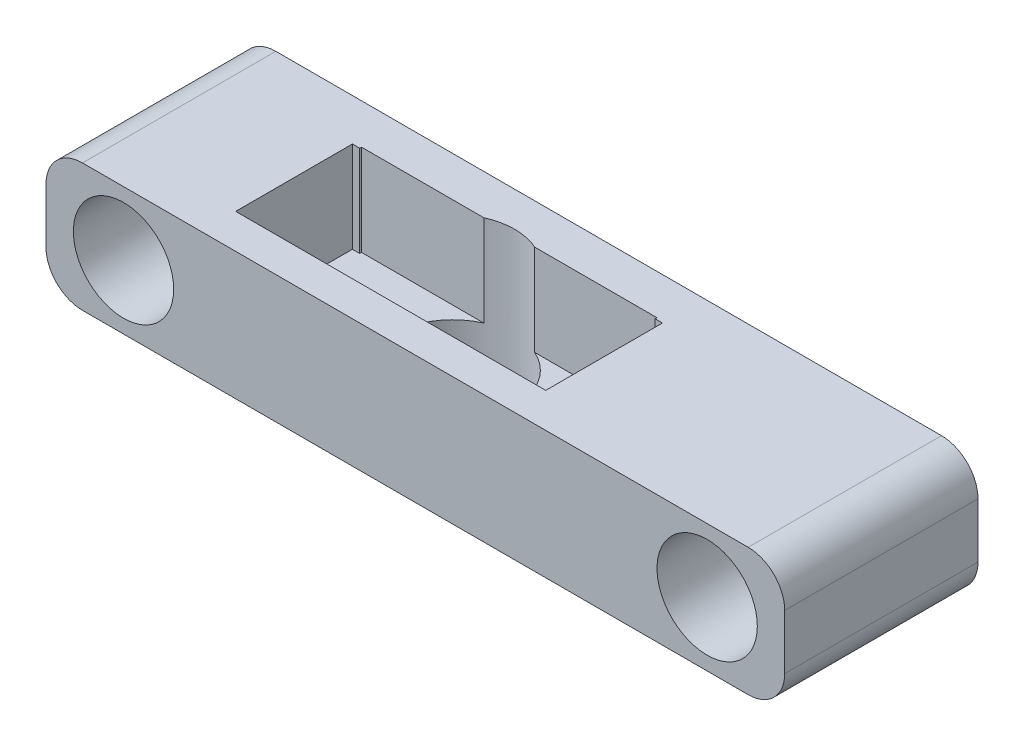
ISO-10303-21;
HEADER;
FILE_DESCRIPTION(('STEP AP214'),'2;1');
FILE_NAME('part.step','',(''),(''),'','','');
FILE_SCHEMA(('AUTOMOTIVE_DESIGN { 1 0 10303 214 1 1 1 1 }'));
ENDSEC;
DATA;
#1=APPLICATION_CONTEXT('core data for automotive mechanical design processes');
#2=APPLICATION_PROTOCOL_DEFINITION('international standard','automotive_design',2000,#1);
#3=PRODUCT_CONTEXT('',#1,'mechanical');
#4=PRODUCT('Part','Part','',(#3));
#5=PRODUCT_RELATED_PRODUCT_CATEGORY('part','',(#4));
#6=PRODUCT_DEFINITION_FORMATION('','',#4);
#7=PRODUCT_DEFINITION_CONTEXT('part definition',#1,'design');
#8=PRODUCT_DEFINITION('design','',#6,#7);
#9=PRODUCT_DEFINITION_SHAPE('','',#8);
#10=(LENGTH_UNIT() NAMED_UNIT(*) SI_UNIT(.MILLI.,.METRE.));
#11=(NAMED_UNIT(*) PLANE_ANGLE_UNIT() SI_UNIT($,.RADIAN.));
#12=(NAMED_UNIT(*) SI_UNIT($,.STERADIAN.) SOLID_ANGLE_UNIT());
#13=UNCERTAINTY_MEASURE_WITH_UNIT(LENGTH_MEASURE(1.E-05),#10,'distance_accuracy_value','');
#14=(GEOMETRIC_REPRESENTATION_CONTEXT(3) GLOBAL_UNCERTAINTY_ASSIGNED_CONTEXT((#13)) GLOBAL_UNIT_ASSIGNED_CONTEXT((#10,
#11,#12)) REPRESENTATION_CONTEXT('',''));
#15=CARTESIAN_POINT('',(0.,0.,0.));
#16=DIRECTION('',(0.,0.,1.));
#17=DIRECTION('',(1.,0.,0.));
#18=AXIS2_PLACEMENT_3D('',#15,#16,#17);
#19=CARTESIAN_POINT('',(0.,0.,10.6));
#20=DIRECTION('',(0.,0.,1.));
#21=DIRECTION('',(1.,0.,0.));
#22=AXIS2_PLACEMENT_3D('',#19,#20,#21);
#23=PLANE('',#22);
#24=CARTESIAN_POINT('',(-42.1830131167364,-10.7865689454531,10.6));
#25=DIRECTION('',(0.,0.,1.));
#26=DIRECTION('',(1.,0.,0.));
#27=AXIS2_PLACEMENT_3D('',#24,#25,#26);
#28=CIRCLE('',#27,2.75);
#29=CARTESIAN_POINT('',(-39.4330131167364,-10.7865689454531,10.6));
#30=VERTEX_POINT('',#29);
#31=EDGE_CURVE('E262',#30,#30,#28,.T.);
#32=ORIENTED_EDGE('',*,*,#31,.F.);
#33=EDGE_LOOP('',(#32));
#34=FACE_BOUND('',#33,.T.);
#35=DIRECTION('',(0.,1.,0.));
#36=VECTOR('',#35,1.);
#37=CARTESIAN_POINT('',(-5.93301311673639,-7.2865689454531,10.6));
#38=LINE('',#37,#36);
#39=CARTESIAN_POINT('',(-5.93301311673639,-12.2865689454531,10.6));
#40=VERTEX_POINT('',#39);
#41=CARTESIAN_POINT('',(-5.93301311673639,-9.2865689454531,10.6));
#42=VERTEX_POINT('',#41);
#43=EDGE_CURVE('E274',#40,#42,#38,.T.);
#44=ORIENTED_EDGE('',*,*,#43,.T.);
#45=CARTESIAN_POINT('',(-7.93301311673639,-9.2865689454531,10.6));
#46=DIRECTION('',(0.,0.,1.));
#47=DIRECTION('',(1.,0.,0.));
#48=AXIS2_PLACEMENT_3D('',#45,#46,#47);
#49=CIRCLE('',#48,2.);
#50=CARTESIAN_POINT('',(-7.93301311673639,-7.2865689454531,10.6));
#51=VERTEX_POINT('',#50);
#52=EDGE_CURVE('E313',#42,#51,#49,.T.);
#53=ORIENTED_EDGE('',*,*,#52,.T.);
#54=DIRECTION('',(-1.,0.,0.));
#55=VECTOR('',#54,1.);
#56=CARTESIAN_POINT('',(-46.4330131167364,-7.2865689454531,10.6));
#57=LINE('',#56,#55);
#58=CARTESIAN_POINT('',(-44.4330131167364,-7.2865689454531,10.6));
#59=VERTEX_POINT('',#58);
#60=EDGE_CURVE('E277',#51,#59,#57,.T.);
#61=ORIENTED_EDGE('',*,*,#60,.T.);
#62=CARTESIAN_POINT('',(-44.4330131167364,-9.2865689454531,10.6));
#63=DIRECTION('',(0.,0.,1.));
#64=DIRECTION('',(1.,0.,0.));
#65=AXIS2_PLACEMENT_3D('',#62,#63,#64);
#66=CIRCLE('',#65,2.);
#67=CARTESIAN_POINT('',(-46.4330131167364,-9.2865689454531,10.6));
#68=VERTEX_POINT('',#67);
#69=EDGE_CURVE('E307',#59,#68,#66,.T.);
#70=ORIENTED_EDGE('',*,*,#69,.T.);
#71=DIRECTION('',(0.,-1.,0.));
#72=VECTOR('',#71,1.);
#73=CARTESIAN_POINT('',(-46.4330131167364,-7.2865689454531,10.6));
#74=LINE('',#73,#72);
#75=CARTESIAN_POINT('',(-46.4330131167364,-12.2865689454531,10.6));
#76=VERTEX_POINT('',#75);
#77=EDGE_CURVE('E268',#68,#76,#74,.T.);
#78=ORIENTED_EDGE('',*,*,#77,.T.);
#79=CARTESIAN_POINT('',(-44.4330131167364,-12.2865689454531,10.6));
#80=DIRECTION('',(0.,0.,1.));
#81=DIRECTION('',(1.,0.,0.));
#82=AXIS2_PLACEMENT_3D('',#79,#80,#81);
#83=CIRCLE('',#82,2.);
#84=CARTESIAN_POINT('',(-44.4330131167364,-14.2865689454531,10.6));
#85=VERTEX_POINT('',#84);
#86=EDGE_CURVE('E309',#76,#85,#83,.T.);
#87=ORIENTED_EDGE('',*,*,#86,.T.);
#88=DIRECTION('',(1.,0.,0.));
#89=VECTOR('',#88,1.);
#90=CARTESIAN_POINT('',(-46.4330131167364,-14.2865689454531,10.6));
#91=LINE('',#90,#89);
#92=CARTESIAN_POINT('',(-7.93301311673639,-14.2865689454531,10.6));
#93=VERTEX_POINT('',#92);
#94=EDGE_CURVE('E271',#85,#93,#91,.T.);
#95=ORIENTED_EDGE('',*,*,#94,.T.);
#96=CARTESIAN_POINT('',(-7.93301311673639,-12.2865689454531,10.6));
#97=DIRECTION('',(0.,0.,1.));
#98=DIRECTION('',(1.,0.,0.));
#99=AXIS2_PLACEMENT_3D('',#96,#97,#98);
#100=CIRCLE('',#99,2.);
#101=EDGE_CURVE('E311',#93,#40,#100,.T.);
#102=ORIENTED_EDGE('',*,*,#101,.T.);
#103=EDGE_LOOP('',(#44,#53,#61,#70,#78,#87,#95,#102));
#104=FACE_BOUND('',#103,.T.);
#105=CARTESIAN_POINT('',(-10.1830131167364,-10.7865689454531,10.6));
#106=DIRECTION('',(0.,0.,1.));
#107=DIRECTION('',(1.,0.,0.));
#108=AXIS2_PLACEMENT_3D('',#105,#106,#107);
#109=CIRCLE('',#108,2.75);
#110=CARTESIAN_POINT('',(-7.43301311673639,-10.7865689454531,10.6));
#111=VERTEX_POINT('',#110);
#112=EDGE_CURVE('E256',#111,#111,#109,.T.);
#113=ORIENTED_EDGE('',*,*,#112,.F.);
#114=EDGE_LOOP('',(#113));
#115=FACE_BOUND('',#114,.T.);
#116=ADVANCED_FACE('F33',(#34,#104,#115),#23,.T.);
#117=CARTESIAN_POINT('',(0.,0.,0.));
#118=DIRECTION('',(0.,0.,1.));
#119=DIRECTION('',(1.,0.,0.));
#120=AXIS2_PLACEMENT_3D('',#117,#118,#119);
#121=PLANE('',#120);
#122=DIRECTION('',(-1.,0.,0.));
#123=VECTOR('',#122,1.);
#124=CARTESIAN_POINT('',(-46.4330131167364,-7.2865689454531,0.));
#125=LINE('',#124,#123);
#126=CARTESIAN_POINT('',(-7.93301311673639,-7.2865689454531,0.));
#127=VERTEX_POINT('',#126);
#128=CARTESIAN_POINT('',(-44.4330131167364,-7.2865689454531,0.));
#129=VERTEX_POINT('',#128);
#130=EDGE_CURVE('E272',#127,#129,#125,.T.);
#131=ORIENTED_EDGE('',*,*,#130,.F.);
#132=CARTESIAN_POINT('',(-7.93301311673639,-9.2865689454531,0.));
#133=DIRECTION('',(0.,0.,1.));
#134=DIRECTION('',(1.,0.,0.));
#135=AXIS2_PLACEMENT_3D('',#132,#133,#134);
#136=CIRCLE('',#135,2.);
#137=CARTESIAN_POINT('',(-5.93301311673639,-9.2865689454531,0.));
#138=VERTEX_POINT('',#137);
#139=EDGE_CURVE('E300',#127,#138,#136,.F.);
#140=ORIENTED_EDGE('',*,*,#139,.T.);
#141=DIRECTION('',(0.,1.,0.));
#142=VECTOR('',#141,1.);
#143=CARTESIAN_POINT('',(-5.93301311673639,-7.2865689454531,0.));
#144=LINE('',#143,#142);
#145=CARTESIAN_POINT('',(-5.93301311673639,-12.2865689454531,0.));
#146=VERTEX_POINT('',#145);
#147=EDGE_CURVE('E285',#146,#138,#144,.T.);
#148=ORIENTED_EDGE('',*,*,#147,.F.);
#149=CARTESIAN_POINT('',(-7.93301311673639,-12.2865689454531,0.));
#150=DIRECTION('',(0.,0.,1.));
#151=DIRECTION('',(1.,0.,0.));
#152=AXIS2_PLACEMENT_3D('',#149,#150,#151);
#153=CIRCLE('',#152,2.);
#154=CARTESIAN_POINT('',(-7.93301311673639,-14.2865689454531,0.));
#155=VERTEX_POINT('',#154);
#156=EDGE_CURVE('E298',#146,#155,#153,.F.);
#157=ORIENTED_EDGE('',*,*,#156,.T.);
#158=DIRECTION('',(1.,0.,0.));
#159=VECTOR('',#158,1.);
#160=CARTESIAN_POINT('',(-46.4330131167364,-14.2865689454531,0.));
#161=LINE('',#160,#159);
#162=CARTESIAN_POINT('',(-44.4330131167364,-14.2865689454531,0.));
#163=VERTEX_POINT('',#162);
#164=EDGE_CURVE('E283',#163,#155,#161,.T.);
#165=ORIENTED_EDGE('',*,*,#164,.F.);
#166=CARTESIAN_POINT('',(-44.4330131167364,-12.2865689454531,0.));
#167=DIRECTION('',(0.,0.,1.));
#168=DIRECTION('',(1.,0.,0.));
#169=AXIS2_PLACEMENT_3D('',#166,#167,#168);
#170=CIRCLE('',#169,2.);
#171=CARTESIAN_POINT('',(-46.4330131167364,-12.2865689454531,0.));
#172=VERTEX_POINT('',#171);
#173=EDGE_CURVE('E296',#163,#172,#170,.F.);
#174=ORIENTED_EDGE('',*,*,#173,.T.);
#175=DIRECTION('',(0.,-1.,0.));
#176=VECTOR('',#175,1.);
#177=CARTESIAN_POINT('',(-46.4330131167364,-7.2865689454531,0.));
#178=LINE('',#177,#176);
#179=CARTESIAN_POINT('',(-46.4330131167364,-9.2865689454531,0.));
#180=VERTEX_POINT('',#179);
#181=EDGE_CURVE('E265',#180,#172,#178,.T.);
#182=ORIENTED_EDGE('',*,*,#181,.F.);
#183=CARTESIAN_POINT('',(-44.4330131167364,-9.2865689454531,0.));
#184=DIRECTION('',(0.,0.,1.));
#185=DIRECTION('',(1.,0.,0.));
#186=AXIS2_PLACEMENT_3D('',#183,#184,#185);
#187=CIRCLE('',#186,2.);
#188=EDGE_CURVE('E294',#180,#129,#187,.F.);
#189=ORIENTED_EDGE('',*,*,#188,.T.);
#190=EDGE_LOOP('',(#131,#140,#148,#157,#165,#174,#182,#189));
#191=FACE_BOUND('',#190,.T.);
#192=CARTESIAN_POINT('',(-42.1830131167364,-10.7865689454531,0.));
#193=DIRECTION('',(0.,0.,1.));
#194=DIRECTION('',(1.,0.,0.));
#195=AXIS2_PLACEMENT_3D('',#192,#193,#194);
#196=CIRCLE('',#195,2.75);
#197=CARTESIAN_POINT('',(-39.4330131167364,-10.7865689454531,0.));
#198=VERTEX_POINT('',#197);
#199=EDGE_CURVE('E259',#198,#198,#196,.T.);
#200=ORIENTED_EDGE('',*,*,#199,.T.);
#201=EDGE_LOOP('',(#200));
#202=FACE_BOUND('',#201,.T.);
#203=CARTESIAN_POINT('',(-10.1830131167364,-10.7865689454531,0.));
#204=DIRECTION('',(0.,0.,1.));
#205=DIRECTION('',(1.,0.,0.));
#206=AXIS2_PLACEMENT_3D('',#203,#204,#205);
#207=CIRCLE('',#206,2.75);
#208=CARTESIAN_POINT('',(-7.43301311673639,-10.7865689454531,0.));
#209=VERTEX_POINT('',#208);
#210=EDGE_CURVE('E253',#209,#209,#207,.T.);
#211=ORIENTED_EDGE('',*,*,#210,.T.);
#212=EDGE_LOOP('',(#211));
#213=FACE_BOUND('',#212,.T.);
#214=ADVANCED_FACE('F377',(#191,#202,#213),#121,.F.);
#215=CARTESIAN_POINT('',(-46.4330131167364,-7.2865689454531,10.6));
#216=DIRECTION('',(1.,0.,0.));
#217=DIRECTION('',(0.,1.,0.));
#218=AXIS2_PLACEMENT_3D('',#215,#216,#217);
#219=PLANE('',#218);
#220=ORIENTED_EDGE('',*,*,#181,.T.);
#221=DIRECTION('',(0.,0.,-1.));
#222=VECTOR('',#221,1.);
#223=CARTESIAN_POINT('',(-46.4330131167364,-12.2865689454531,10.6));
#224=LINE('',#223,#222);
#225=EDGE_CURVE('E322',#172,#76,#224,.F.);
#226=ORIENTED_EDGE('',*,*,#225,.T.);
#227=ORIENTED_EDGE('',*,*,#77,.F.);
#228=DIRECTION('',(0.,0.,-1.));
#229=VECTOR('',#228,1.);
#230=CARTESIAN_POINT('',(-46.4330131167364,-9.2865689454531,10.6));
#231=LINE('',#230,#229);
#232=EDGE_CURVE('E319',#68,#180,#231,.T.);
#233=ORIENTED_EDGE('',*,*,#232,.T.);
#234=EDGE_LOOP('',(#220,#226,#227,#233));
#235=FACE_BOUND('',#234,.T.);
#236=ADVANCED_FACE('F383',(#235),#219,.F.);
#237=CARTESIAN_POINT('',(-46.4330131167364,-14.2865689454531,10.6));
#238=DIRECTION('',(0.,1.,0.));
#239=DIRECTION('',(-1.,0.,0.));
#240=AXIS2_PLACEMENT_3D('',#237,#238,#239);
#241=PLANE('',#240);
#242=CARTESIAN_POINT('',(-22.9330131167364,-14.2865689454531,5.49999999999999));
#243=DIRECTION('',(0.,1.,0.));
#244=DIRECTION('',(0.,0.,1.));
#245=AXIS2_PLACEMENT_3D('',#242,#243,#244);
#246=CIRCLE('',#245,1.5);
#247=CARTESIAN_POINT('',(-22.9330131167364,-14.2865689454531,6.99999999999999));
#248=VERTEX_POINT('',#247);
#249=EDGE_CURVE('E205',#248,#248,#246,.T.);
#250=ORIENTED_EDGE('',*,*,#249,.T.);
#251=EDGE_LOOP('',(#250));
#252=FACE_BOUND('',#251,.T.);
#253=CARTESIAN_POINT('',(-35.9330131167364,-14.2865689454531,5.49999999999999));
#254=DIRECTION('',(0.,1.,0.));
#255=DIRECTION('',(0.,0.,1.));
#256=AXIS2_PLACEMENT_3D('',#253,#254,#255);
#257=CIRCLE('',#256,1.5);
#258=CARTESIAN_POINT('',(-35.9330131167364,-14.2865689454531,6.99999999999999));
#259=VERTEX_POINT('',#258);
#260=EDGE_CURVE('E212',#259,#259,#257,.T.);
#261=ORIENTED_EDGE('',*,*,#260,.T.);
#262=EDGE_LOOP('',(#261));
#263=FACE_BOUND('',#262,.T.);
#264=CARTESIAN_POINT('',(-29.4330131167364,-14.2865689454531,5.3));
#265=DIRECTION('',(0.,-1.,0.));
#266=DIRECTION('',(0.,0.,-1.));
#267=AXIS2_PLACEMENT_3D('',#264,#265,#266);
#268=CIRCLE('',#267,3.4);
#269=CARTESIAN_POINT('',(-29.4330131167364,-14.2865689454531,1.9));
#270=VERTEX_POINT('',#269);
#271=EDGE_CURVE('E242',#270,#270,#268,.T.);
#272=ORIENTED_EDGE('',*,*,#271,.F.);
#273=EDGE_LOOP('',(#272));
#274=FACE_BOUND('',#273,.T.);
#275=ORIENTED_EDGE('',*,*,#164,.T.);
#276=DIRECTION('',(0.,0.,-1.));
#277=VECTOR('',#276,1.);
#278=CARTESIAN_POINT('',(-7.93301311673639,-14.2865689454531,10.6));
#279=LINE('',#278,#277);
#280=EDGE_CURVE('E56',#155,#93,#279,.F.);
#281=ORIENTED_EDGE('',*,*,#280,.T.);
#282=ORIENTED_EDGE('',*,*,#94,.F.);
#283=DIRECTION('',(0.,0.,-1.));
#284=VECTOR('',#283,1.);
#285=CARTESIAN_POINT('',(-44.4330131167364,-14.2865689454531,10.6));
#286=LINE('',#285,#284);
#287=EDGE_CURVE('E315',#85,#163,#286,.T.);
#288=ORIENTED_EDGE('',*,*,#287,.T.);
#289=EDGE_LOOP('',(#275,#281,#282,#288));
#290=FACE_BOUND('',#289,.T.);
#291=ADVANCED_FACE('F397',(#252,#263,#274,#290),#241,.F.);
#292=CARTESIAN_POINT('',(-5.93301311673639,-7.2865689454531,10.6));
#293=DIRECTION('',(-1.,0.,0.));
#294=DIRECTION('',(0.,-1.,0.));
#295=AXIS2_PLACEMENT_3D('',#292,#293,#294);
#296=PLANE('',#295);
#297=ORIENTED_EDGE('',*,*,#147,.T.);
#298=DIRECTION('',(0.,0.,-1.));
#299=VECTOR('',#298,1.);
#300=CARTESIAN_POINT('',(-5.93301311673639,-9.2865689454531,10.6));
#301=LINE('',#300,#299);
#302=EDGE_CURVE('E305',#138,#42,#301,.F.);
#303=ORIENTED_EDGE('',*,*,#302,.T.);
#304=ORIENTED_EDGE('',*,*,#43,.F.);
#305=DIRECTION('',(0.,0.,-1.));
#306=VECTOR('',#305,1.);
#307=CARTESIAN_POINT('',(-5.93301311673639,-12.2865689454531,10.6));
#308=LINE('',#307,#306);
#309=EDGE_CURVE('E302',#40,#146,#308,.T.);
#310=ORIENTED_EDGE('',*,*,#309,.T.);
#311=EDGE_LOOP('',(#297,#303,#304,#310));
#312=FACE_BOUND('',#311,.T.);
#313=ADVANCED_FACE('F394',(#312),#296,.F.);
#314=CARTESIAN_POINT('',(-46.4330131167364,-7.2865689454531,10.6));
#315=DIRECTION('',(0.,-1.,0.));
#316=DIRECTION('',(1.,0.,0.));
#317=AXIS2_PLACEMENT_3D('',#314,#315,#316);
#318=PLANE('',#317);
#319=DIRECTION('',(-1.,0.,0.));
#320=VECTOR('',#319,1.);
#321=CARTESIAN_POINT('',(-20.9330131167364,-7.2865689454531,2.29999999999999));
#322=LINE('',#321,#320);
#323=CARTESIAN_POINT('',(-37.5330131167364,-7.2865689454531,2.29999999999999));
#324=VERTEX_POINT('',#323);
#325=CARTESIAN_POINT('',(-37.9330131167364,-7.2865689454531,2.29999999999999));
#326=VERTEX_POINT('',#325);
#327=EDGE_CURVE('E208',#324,#326,#322,.T.);
#328=ORIENTED_EDGE('',*,*,#327,.F.);
#329=DIRECTION('',(0.,0.,1.));
#330=VECTOR('',#329,1.);
#331=CARTESIAN_POINT('',(-37.5330131167364,-7.2865689454531,2.2));
#332=LINE('',#331,#330);
#333=CARTESIAN_POINT('',(-37.5330131167364,-7.2865689454531,2.2));
#334=VERTEX_POINT('',#333);
#335=EDGE_CURVE('E191',#334,#324,#332,.T.);
#336=ORIENTED_EDGE('',*,*,#335,.F.);
#337=DIRECTION('',(-1.,0.,0.));
#338=VECTOR('',#337,1.);
#339=CARTESIAN_POINT('',(-21.3330131167364,-7.2865689454531,2.2));
#340=LINE('',#339,#338);
#341=CARTESIAN_POINT('',(-30.8294371211133,-7.2865689454531,2.2));
#342=VERTEX_POINT('',#341);
#343=EDGE_CURVE('E194',#342,#334,#340,.T.);
#344=ORIENTED_EDGE('',*,*,#343,.F.);
#345=CARTESIAN_POINT('',(-29.4330131167364,-7.2865689454531,5.3));
#346=DIRECTION('',(0.,-1.,0.));
#347=DIRECTION('',(0.,0.,-1.));
#348=AXIS2_PLACEMENT_3D('',#345,#346,#347);
#349=CIRCLE('',#348,3.4);
#350=CARTESIAN_POINT('',(-28.0365891123595,-7.2865689454531,2.2));
#351=VERTEX_POINT('',#350);
#352=EDGE_CURVE('E250',#342,#351,#349,.T.);
#353=ORIENTED_EDGE('',*,*,#352,.T.);
#354=CARTESIAN_POINT('',(-21.3330131167364,-7.2865689454531,2.2));
#355=VERTEX_POINT('',#354);
#356=EDGE_CURVE('E195',#355,#351,#340,.T.);
#357=ORIENTED_EDGE('',*,*,#356,.F.);
#358=DIRECTION('',(0.,0.,-1.));
#359=VECTOR('',#358,1.);
#360=CARTESIAN_POINT('',(-21.3330131167364,-7.2865689454531,2.2));
#361=LINE('',#360,#359);
#362=CARTESIAN_POINT('',(-21.3330131167364,-7.2865689454531,2.29999999999999));
#363=VERTEX_POINT('',#362);
#364=EDGE_CURVE('E180',#363,#355,#361,.T.);
#365=ORIENTED_EDGE('',*,*,#364,.F.);
#366=CARTESIAN_POINT('',(-20.9330131167364,-7.2865689454531,2.29999999999999));
#367=VERTEX_POINT('',#366);
#368=EDGE_CURVE('E229',#367,#363,#322,.T.);
#369=ORIENTED_EDGE('',*,*,#368,.F.);
#370=DIRECTION('',(0.,0.,-1.));
#371=VECTOR('',#370,1.);
#372=CARTESIAN_POINT('',(-20.9330131167364,-7.2865689454531,8.7));
#373=LINE('',#372,#371);
#374=CARTESIAN_POINT('',(-20.9330131167364,-7.2865689454531,8.7));
#375=VERTEX_POINT('',#374);
#376=EDGE_CURVE('E237',#375,#367,#373,.T.);
#377=ORIENTED_EDGE('',*,*,#376,.F.);
#378=DIRECTION('',(1.,0.,0.));
#379=VECTOR('',#378,1.);
#380=CARTESIAN_POINT('',(-37.9330131167364,-7.2865689454531,8.7));
#381=LINE('',#380,#379);
#382=CARTESIAN_POINT('',(-37.9330131167364,-7.2865689454531,8.7));
#383=VERTEX_POINT('',#382);
#384=EDGE_CURVE('E235',#383,#375,#381,.T.);
#385=ORIENTED_EDGE('',*,*,#384,.F.);
#386=DIRECTION('',(0.,0.,1.));
#387=VECTOR('',#386,1.);
#388=CARTESIAN_POINT('',(-37.9330131167364,-7.2865689454531,2.29999999999999));
#389=LINE('',#388,#387);
#390=EDGE_CURVE('E232',#326,#383,#389,.T.);
#391=ORIENTED_EDGE('',*,*,#390,.F.);
#392=EDGE_LOOP('',(#328,#336,#344,#353,#357,#365,#369,#377,#385,#391));
#393=FACE_BOUND('',#392,.T.);
#394=ORIENTED_EDGE('',*,*,#60,.F.);
#395=DIRECTION('',(0.,0.,-1.));
#396=VECTOR('',#395,1.);
#397=CARTESIAN_POINT('',(-7.93301311673639,-7.2865689454531,10.6));
#398=LINE('',#397,#396);
#399=EDGE_CURVE('E291',#51,#127,#398,.T.);
#400=ORIENTED_EDGE('',*,*,#399,.T.);
#401=ORIENTED_EDGE('',*,*,#130,.T.);
#402=DIRECTION('',(0.,0.,-1.));
#403=VECTOR('',#402,1.);
#404=CARTESIAN_POINT('',(-44.4330131167364,-7.2865689454531,10.6));
#405=LINE('',#404,#403);
#406=EDGE_CURVE('E280',#129,#59,#405,.F.);
#407=ORIENTED_EDGE('',*,*,#406,.T.);
#408=EDGE_LOOP('',(#394,#400,#401,#407));
#409=FACE_BOUND('',#408,.T.);
#410=ADVANCED_FACE('F341',(#393,#409),#318,.F.);
#411=CARTESIAN_POINT('',(-42.1830131167364,-10.7865689454531,10.6));
#412=DIRECTION('',(0.,0.,-1.));
#413=DIRECTION('',(-1.,0.,0.));
#414=AXIS2_PLACEMENT_3D('',#411,#412,#413);
#415=CYLINDRICAL_SURFACE('',#414,2.75);
#416=ORIENTED_EDGE('',*,*,#31,.T.);
#417=EDGE_LOOP('',(#416));
#418=FACE_BOUND('',#417,.T.);
#419=ORIENTED_EDGE('',*,*,#199,.F.);
#420=EDGE_LOOP('',(#419));
#421=FACE_BOUND('',#420,.T.);
#422=ADVANCED_FACE('F389',(#418,#421),#415,.F.);
#423=CARTESIAN_POINT('',(-10.1830131167364,-10.7865689454531,10.6));
#424=DIRECTION('',(0.,0.,-1.));
#425=DIRECTION('',(-1.,0.,0.));
#426=AXIS2_PLACEMENT_3D('',#423,#424,#425);
#427=CYLINDRICAL_SURFACE('',#426,2.75);
#428=ORIENTED_EDGE('',*,*,#112,.T.);
#429=EDGE_LOOP('',(#428));
#430=FACE_BOUND('',#429,.T.);
#431=ORIENTED_EDGE('',*,*,#210,.F.);
#432=EDGE_LOOP('',(#431));
#433=FACE_BOUND('',#432,.T.);
#434=ADVANCED_FACE('F440',(#430,#433),#427,.F.);
#435=CARTESIAN_POINT('',(-29.4330131167364,-7.2865689454531,5.3));
#436=DIRECTION('',(0.,-1.,0.));
#437=DIRECTION('',(0.,0.,-1.));
#438=AXIS2_PLACEMENT_3D('',#435,#436,#437);
#439=CYLINDRICAL_SURFACE('',#438,3.4);
#440=ORIENTED_EDGE('',*,*,#352,.F.);
#441=DIRECTION('',(0.,-1.,0.));
#442=VECTOR('',#441,1.);
#443=CARTESIAN_POINT('',(-30.8294371211133,-7.2865689454531,2.2));
#444=LINE('',#443,#442);
#445=CARTESIAN_POINT('',(-30.8294371211133,-12.2865689454531,2.2));
#446=VERTEX_POINT('',#445);
#447=EDGE_CURVE('E11',#342,#446,#444,.T.);
#448=ORIENTED_EDGE('',*,*,#447,.T.);
#449=CARTESIAN_POINT('',(-29.4330131167364,-12.2865689454531,5.3));
#450=DIRECTION('',(0.,1.,0.));
#451=DIRECTION('',(0.,0.,1.));
#452=AXIS2_PLACEMENT_3D('',#449,#450,#451);
#453=CIRCLE('',#452,3.4);
#454=CARTESIAN_POINT('',(-29.4330131167364,-12.2865689454531,8.7));
#455=VERTEX_POINT('',#454);
#456=EDGE_CURVE('E325',#455,#446,#453,.F.);
#457=ORIENTED_EDGE('',*,*,#456,.F.);
#458=CARTESIAN_POINT('',(-28.0365891123595,-12.2865689454531,2.2));
#459=VERTEX_POINT('',#458);
#460=EDGE_CURVE('E324',#459,#455,#453,.F.);
#461=ORIENTED_EDGE('',*,*,#460,.F.);
#462=DIRECTION('',(0.,-1.,0.));
#463=VECTOR('',#462,1.);
#464=CARTESIAN_POINT('',(-28.0365891123595,-7.2865689454531,2.2));
#465=LINE('',#464,#463);
#466=EDGE_CURVE('E41',#459,#351,#465,.F.);
#467=ORIENTED_EDGE('',*,*,#466,.T.);
#468=EDGE_LOOP('',(#440,#448,#457,#461,#467));
#469=FACE_BOUND('',#468,.T.);
#470=ORIENTED_EDGE('',*,*,#271,.T.);
#471=EDGE_LOOP('',(#470));
#472=FACE_BOUND('',#471,.T.);
#473=ADVANCED_FACE('F337',(#469,#472),#439,.F.);
#474=CARTESIAN_POINT('',(-7.93301311673639,-9.2865689454531,10.6));
#475=DIRECTION('',(0.,0.,-1.));
#476=DIRECTION('',(-1.,0.,0.));
#477=AXIS2_PLACEMENT_3D('',#474,#475,#476);
#478=CYLINDRICAL_SURFACE('',#477,2.);
#479=ORIENTED_EDGE('',*,*,#52,.F.);
#480=ORIENTED_EDGE('',*,*,#302,.F.);
#481=ORIENTED_EDGE('',*,*,#139,.F.);
#482=ORIENTED_EDGE('',*,*,#399,.F.);
#483=EDGE_LOOP('',(#479,#480,#481,#482));
#484=FACE_BOUND('',#483,.T.);
#485=ADVANCED_FACE('F405',(#484),#478,.T.);
#486=CARTESIAN_POINT('',(-7.93301311673639,-12.2865689454531,10.6));
#487=DIRECTION('',(0.,0.,-1.));
#488=DIRECTION('',(-1.,0.,0.));
#489=AXIS2_PLACEMENT_3D('',#486,#487,#488);
#490=CYLINDRICAL_SURFACE('',#489,2.);
#491=ORIENTED_EDGE('',*,*,#101,.F.);
#492=ORIENTED_EDGE('',*,*,#280,.F.);
#493=ORIENTED_EDGE('',*,*,#156,.F.);
#494=ORIENTED_EDGE('',*,*,#309,.F.);
#495=EDGE_LOOP('',(#491,#492,#493,#494));
#496=FACE_BOUND('',#495,.T.);
#497=ADVANCED_FACE('F408',(#496),#490,.T.);
#498=CARTESIAN_POINT('',(-44.4330131167364,-12.2865689454531,10.6));
#499=DIRECTION('',(0.,0.,-1.));
#500=DIRECTION('',(-1.,0.,0.));
#501=AXIS2_PLACEMENT_3D('',#498,#499,#500);
#502=CYLINDRICAL_SURFACE('',#501,2.);
#503=ORIENTED_EDGE('',*,*,#86,.F.);
#504=ORIENTED_EDGE('',*,*,#225,.F.);
#505=ORIENTED_EDGE('',*,*,#173,.F.);
#506=ORIENTED_EDGE('',*,*,#287,.F.);
#507=EDGE_LOOP('',(#503,#504,#505,#506));
#508=FACE_BOUND('',#507,.T.);
#509=ADVANCED_FACE('F372',(#508),#502,.T.);
#510=CARTESIAN_POINT('',(-44.4330131167364,-9.2865689454531,10.6));
#511=DIRECTION('',(0.,0.,-1.));
#512=DIRECTION('',(-1.,0.,0.));
#513=AXIS2_PLACEMENT_3D('',#510,#511,#512);
#514=CYLINDRICAL_SURFACE('',#513,2.);
#515=ORIENTED_EDGE('',*,*,#69,.F.);
#516=ORIENTED_EDGE('',*,*,#406,.F.);
#517=ORIENTED_EDGE('',*,*,#188,.F.);
#518=ORIENTED_EDGE('',*,*,#232,.F.);
#519=EDGE_LOOP('',(#515,#516,#517,#518));
#520=FACE_BOUND('',#519,.T.);
#521=ADVANCED_FACE('F35',(#520),#514,.T.);
#522=CARTESIAN_POINT('',(-20.9330131167364,-12.2865689454531,2.29999999999999));
#523=DIRECTION('',(0.,0.,-1.));
#524=DIRECTION('',(-1.,0.,0.));
#525=AXIS2_PLACEMENT_3D('',#522,#523,#524);
#526=PLANE('',#525);
#527=ORIENTED_EDGE('',*,*,#368,.T.);
#528=DIRECTION('',(0.,-1.,0.));
#529=VECTOR('',#528,1.);
#530=CARTESIAN_POINT('',(-21.3330131167364,-12.2865689454531,2.29999999999999));
#531=LINE('',#530,#529);
#532=CARTESIAN_POINT('',(-21.3330131167364,-12.2865689454531,2.29999999999999));
#533=VERTEX_POINT('',#532);
#534=EDGE_CURVE('E198',#363,#533,#531,.T.);
#535=ORIENTED_EDGE('',*,*,#534,.T.);
#536=DIRECTION('',(-1.,0.,0.));
#537=VECTOR('',#536,1.);
#538=CARTESIAN_POINT('',(-20.9330131167364,-12.2865689454531,2.29999999999999));
#539=LINE('',#538,#537);
#540=CARTESIAN_POINT('',(-20.9330131167364,-12.2865689454531,2.29999999999999));
#541=VERTEX_POINT('',#540);
#542=EDGE_CURVE('E171',#541,#533,#539,.T.);
#543=ORIENTED_EDGE('',*,*,#542,.F.);
#544=DIRECTION('',(0.,1.,0.));
#545=VECTOR('',#544,1.);
#546=CARTESIAN_POINT('',(-20.9330131167364,-12.2865689454531,2.29999999999999));
#547=LINE('',#546,#545);
#548=EDGE_CURVE('E240',#541,#367,#547,.T.);
#549=ORIENTED_EDGE('',*,*,#548,.T.);
#550=EDGE_LOOP('',(#527,#535,#543,#549));
#551=FACE_BOUND('',#550,.T.);
#552=ADVANCED_FACE('F365',(#551),#526,.F.);
#553=CARTESIAN_POINT('',(-37.5330131167364,-12.2865689454531,2.29999999999999));
#554=VERTEX_POINT('',#553);
#555=CARTESIAN_POINT('',(-37.9330131167364,-12.2865689454531,2.29999999999999));
#556=VERTEX_POINT('',#555);
#557=EDGE_CURVE('E219',#554,#556,#539,.T.);
#558=ORIENTED_EDGE('',*,*,#557,.F.);
#559=DIRECTION('',(0.,1.,0.));
#560=VECTOR('',#559,1.);
#561=CARTESIAN_POINT('',(-37.5330131167364,-12.2865689454531,2.29999999999999));
#562=LINE('',#561,#560);
#563=EDGE_CURVE('E201',#554,#324,#562,.T.);
#564=ORIENTED_EDGE('',*,*,#563,.T.);
#565=ORIENTED_EDGE('',*,*,#327,.T.);
#566=DIRECTION('',(0.,1.,0.));
#567=VECTOR('',#566,1.);
#568=CARTESIAN_POINT('',(-37.9330131167364,-12.2865689454531,2.29999999999999));
#569=LINE('',#568,#567);
#570=EDGE_CURVE('E228',#556,#326,#569,.T.);
#571=ORIENTED_EDGE('',*,*,#570,.F.);
#572=EDGE_LOOP('',(#558,#564,#565,#571));
#573=FACE_BOUND('',#572,.T.);
#574=ADVANCED_FACE('F349',(#573),#526,.F.);
#575=CARTESIAN_POINT('',(-37.9330131167364,-12.2865689454531,8.7));
#576=DIRECTION('',(0.,0.,1.));
#577=DIRECTION('',(1.,0.,0.));
#578=AXIS2_PLACEMENT_3D('',#575,#576,#577);
#579=PLANE('',#578);
#580=DIRECTION('',(1.,0.,0.));
#581=VECTOR('',#580,1.);
#582=CARTESIAN_POINT('',(-37.9330131167364,-12.2865689454531,8.7));
#583=LINE('',#582,#581);
#584=CARTESIAN_POINT('',(-37.9330131167364,-12.2865689454531,8.7));
#585=VERTEX_POINT('',#584);
#586=EDGE_CURVE('E223',#585,#455,#583,.T.);
#587=ORIENTED_EDGE('',*,*,#586,.F.);
#588=DIRECTION('',(0.,1.,0.));
#589=VECTOR('',#588,1.);
#590=CARTESIAN_POINT('',(-37.9330131167364,-12.2865689454531,8.7));
#591=LINE('',#590,#589);
#592=EDGE_CURVE('E246',#585,#383,#591,.T.);
#593=ORIENTED_EDGE('',*,*,#592,.T.);
#594=ORIENTED_EDGE('',*,*,#384,.T.);
#595=DIRECTION('',(0.,1.,0.));
#596=VECTOR('',#595,1.);
#597=CARTESIAN_POINT('',(-20.9330131167364,-12.2865689454531,8.7));
#598=LINE('',#597,#596);
#599=CARTESIAN_POINT('',(-20.9330131167364,-12.2865689454531,8.7));
#600=VERTEX_POINT('',#599);
#601=EDGE_CURVE('E243',#600,#375,#598,.T.);
#602=ORIENTED_EDGE('',*,*,#601,.F.);
#603=EDGE_CURVE('E222',#455,#600,#583,.T.);
#604=ORIENTED_EDGE('',*,*,#603,.F.);
#605=EDGE_LOOP('',(#587,#593,#594,#602,#604));
#606=FACE_BOUND('',#605,.T.);
#607=ADVANCED_FACE('F357',(#606),#579,.F.);
#608=CARTESIAN_POINT('',(0.,-12.2865689454531,0.));
#609=DIRECTION('',(0.,1.,0.));
#610=DIRECTION('',(0.,0.,1.));
#611=AXIS2_PLACEMENT_3D('',#608,#609,#610);
#612=PLANE('',#611);
#613=ORIENTED_EDGE('',*,*,#456,.T.);
#614=DIRECTION('',(-1.,0.,0.));
#615=VECTOR('',#614,1.);
#616=CARTESIAN_POINT('',(-21.3330131167364,-12.2865689454531,2.2));
#617=LINE('',#616,#615);
#618=CARTESIAN_POINT('',(-37.5330131167364,-12.2865689454531,2.2));
#619=VERTEX_POINT('',#618);
#620=EDGE_CURVE('E174',#446,#619,#617,.T.);
#621=ORIENTED_EDGE('',*,*,#620,.T.);
#622=DIRECTION('',(0.,0.,1.));
#623=VECTOR('',#622,1.);
#624=CARTESIAN_POINT('',(-37.5330131167364,-12.2865689454531,2.2));
#625=LINE('',#624,#623);
#626=EDGE_CURVE('E48',#619,#554,#625,.T.);
#627=ORIENTED_EDGE('',*,*,#626,.T.);
#628=ORIENTED_EDGE('',*,*,#557,.T.);
#629=DIRECTION('',(0.,0.,1.));
#630=VECTOR('',#629,1.);
#631=CARTESIAN_POINT('',(-37.9330131167364,-12.2865689454531,2.29999999999999));
#632=LINE('',#631,#630);
#633=EDGE_CURVE('E218',#556,#585,#632,.T.);
#634=ORIENTED_EDGE('',*,*,#633,.T.);
#635=ORIENTED_EDGE('',*,*,#586,.T.);
#636=EDGE_LOOP('',(#613,#621,#627,#628,#634,#635));
#637=FACE_BOUND('',#636,.T.);
#638=CARTESIAN_POINT('',(-35.9330131167364,-12.2865689454531,5.49999999999999));
#639=DIRECTION('',(0.,1.,0.));
#640=DIRECTION('',(0.,0.,1.));
#641=AXIS2_PLACEMENT_3D('',#638,#639,#640);
#642=CIRCLE('',#641,1.5);
#643=CARTESIAN_POINT('',(-35.9330131167364,-12.2865689454531,6.99999999999999));
#644=VERTEX_POINT('',#643);
#645=EDGE_CURVE('E204',#644,#644,#642,.T.);
#646=ORIENTED_EDGE('',*,*,#645,.F.);
#647=EDGE_LOOP('',(#646));
#648=FACE_BOUND('',#647,.T.);
#649=ADVANCED_FACE('F330',(#637,#648),#612,.T.);
#650=ORIENTED_EDGE('',*,*,#542,.T.);
#651=DIRECTION('',(0.,0.,-1.));
#652=VECTOR('',#651,1.);
#653=CARTESIAN_POINT('',(-21.3330131167364,-12.2865689454531,2.2));
#654=LINE('',#653,#652);
#655=CARTESIAN_POINT('',(-21.3330131167364,-12.2865689454531,2.2));
#656=VERTEX_POINT('',#655);
#657=EDGE_CURVE('E163',#533,#656,#654,.T.);
#658=ORIENTED_EDGE('',*,*,#657,.T.);
#659=EDGE_CURVE('E168',#656,#459,#617,.T.);
#660=ORIENTED_EDGE('',*,*,#659,.T.);
#661=ORIENTED_EDGE('',*,*,#460,.T.);
#662=ORIENTED_EDGE('',*,*,#603,.T.);
#663=DIRECTION('',(0.,0.,-1.));
#664=VECTOR('',#663,1.);
#665=CARTESIAN_POINT('',(-20.9330131167364,-12.2865689454531,8.7));
#666=LINE('',#665,#664);
#667=EDGE_CURVE('E226',#600,#541,#666,.T.);
#668=ORIENTED_EDGE('',*,*,#667,.T.);
#669=EDGE_LOOP('',(#650,#658,#660,#661,#662,#668));
#670=FACE_BOUND('',#669,.T.);
#671=CARTESIAN_POINT('',(-22.9330131167364,-12.2865689454531,5.49999999999999));
#672=DIRECTION('',(0.,1.,0.));
#673=DIRECTION('',(0.,0.,1.));
#674=AXIS2_PLACEMENT_3D('',#671,#672,#673);
#675=CIRCLE('',#674,1.5);
#676=CARTESIAN_POINT('',(-22.9330131167364,-12.2865689454531,6.99999999999999));
#677=VERTEX_POINT('',#676);
#678=EDGE_CURVE('E209',#677,#677,#675,.T.);
#679=ORIENTED_EDGE('',*,*,#678,.F.);
#680=EDGE_LOOP('',(#679));
#681=FACE_BOUND('',#680,.T.);
#682=ADVANCED_FACE('F165',(#670,#681),#612,.T.);
#683=CARTESIAN_POINT('',(-20.9330131167364,-12.2865689454531,8.7));
#684=DIRECTION('',(1.,0.,0.));
#685=DIRECTION('',(0.,0.,-1.));
#686=AXIS2_PLACEMENT_3D('',#683,#684,#685);
#687=PLANE('',#686);
#688=ORIENTED_EDGE('',*,*,#376,.T.);
#689=ORIENTED_EDGE('',*,*,#548,.F.);
#690=ORIENTED_EDGE('',*,*,#667,.F.);
#691=ORIENTED_EDGE('',*,*,#601,.T.);
#692=EDGE_LOOP('',(#688,#689,#690,#691));
#693=FACE_BOUND('',#692,.T.);
#694=ADVANCED_FACE('F361',(#693),#687,.F.);
#695=CARTESIAN_POINT('',(-37.9330131167364,-12.2865689454531,2.29999999999999));
#696=DIRECTION('',(-1.,0.,0.));
#697=DIRECTION('',(0.,0.,1.));
#698=AXIS2_PLACEMENT_3D('',#695,#696,#697);
#699=PLANE('',#698);
#700=ORIENTED_EDGE('',*,*,#390,.T.);
#701=ORIENTED_EDGE('',*,*,#592,.F.);
#702=ORIENTED_EDGE('',*,*,#633,.F.);
#703=ORIENTED_EDGE('',*,*,#570,.T.);
#704=EDGE_LOOP('',(#700,#701,#702,#703));
#705=FACE_BOUND('',#704,.T.);
#706=ADVANCED_FACE('F352',(#705),#699,.F.);
#707=CARTESIAN_POINT('',(-22.9330131167364,-14.2865689454531,5.49999999999999));
#708=DIRECTION('',(0.,1.,0.));
#709=DIRECTION('',(0.,0.,1.));
#710=AXIS2_PLACEMENT_3D('',#707,#708,#709);
#711=CYLINDRICAL_SURFACE('',#710,1.5);
#712=ORIENTED_EDGE('',*,*,#249,.F.);
#713=EDGE_LOOP('',(#712));
#714=FACE_BOUND('',#713,.T.);
#715=ORIENTED_EDGE('',*,*,#678,.T.);
#716=EDGE_LOOP('',(#715));
#717=FACE_BOUND('',#716,.T.);
#718=ADVANCED_FACE('F560',(#714,#717),#711,.F.);
#719=CARTESIAN_POINT('',(-35.9330131167364,-14.2865689454531,5.49999999999999));
#720=DIRECTION('',(0.,1.,0.));
#721=DIRECTION('',(0.,0.,1.));
#722=AXIS2_PLACEMENT_3D('',#719,#720,#721);
#723=CYLINDRICAL_SURFACE('',#722,1.5);
#724=ORIENTED_EDGE('',*,*,#260,.F.);
#725=EDGE_LOOP('',(#724));
#726=FACE_BOUND('',#725,.T.);
#727=ORIENTED_EDGE('',*,*,#645,.T.);
#728=EDGE_LOOP('',(#727));
#729=FACE_BOUND('',#728,.T.);
#730=ADVANCED_FACE('F565',(#726,#729),#723,.F.);
#731=CARTESIAN_POINT('',(-37.5330131167364,-12.2865689454531,2.2));
#732=DIRECTION('',(-1.,0.,0.));
#733=DIRECTION('',(0.,0.,1.));
#734=AXIS2_PLACEMENT_3D('',#731,#732,#733);
#735=PLANE('',#734);
#736=ORIENTED_EDGE('',*,*,#626,.F.);
#737=DIRECTION('',(0.,1.,0.));
#738=VECTOR('',#737,1.);
#739=CARTESIAN_POINT('',(-37.5330131167364,-12.2865689454531,2.2));
#740=LINE('',#739,#738);
#741=EDGE_CURVE('E183',#619,#334,#740,.T.);
#742=ORIENTED_EDGE('',*,*,#741,.T.);
#743=ORIENTED_EDGE('',*,*,#335,.T.);
#744=ORIENTED_EDGE('',*,*,#563,.F.);
#745=EDGE_LOOP('',(#736,#742,#743,#744));
#746=FACE_BOUND('',#745,.T.);
#747=ADVANCED_FACE('F345',(#746),#735,.F.);
#748=CARTESIAN_POINT('',(-21.3330131167364,-12.2865689454531,2.2));
#749=DIRECTION('',(0.,0.,-1.));
#750=DIRECTION('',(-1.,0.,0.));
#751=AXIS2_PLACEMENT_3D('',#748,#749,#750);
#752=PLANE('',#751);
#753=ORIENTED_EDGE('',*,*,#343,.T.);
#754=ORIENTED_EDGE('',*,*,#741,.F.);
#755=ORIENTED_EDGE('',*,*,#620,.F.);
#756=ORIENTED_EDGE('',*,*,#447,.F.);
#757=EDGE_LOOP('',(#753,#754,#755,#756));
#758=FACE_BOUND('',#757,.T.);
#759=ADVANCED_FACE('F335',(#758),#752,.F.);
#760=ORIENTED_EDGE('',*,*,#659,.F.);
#761=DIRECTION('',(0.,1.,0.));
#762=VECTOR('',#761,1.);
#763=CARTESIAN_POINT('',(-21.3330131167364,-12.2865689454531,2.2));
#764=LINE('',#763,#762);
#765=EDGE_CURVE('E177',#656,#355,#764,.T.);
#766=ORIENTED_EDGE('',*,*,#765,.T.);
#767=ORIENTED_EDGE('',*,*,#356,.T.);
#768=ORIENTED_EDGE('',*,*,#466,.F.);
#769=EDGE_LOOP('',(#760,#766,#767,#768));
#770=FACE_BOUND('',#769,.T.);
#771=ADVANCED_FACE('F186',(#770),#752,.F.);
#772=CARTESIAN_POINT('',(-21.3330131167364,-12.2865689454531,2.2));
#773=DIRECTION('',(1.,0.,0.));
#774=DIRECTION('',(0.,0.,-1.));
#775=AXIS2_PLACEMENT_3D('',#772,#773,#774);
#776=PLANE('',#775);
#777=ORIENTED_EDGE('',*,*,#364,.T.);
#778=ORIENTED_EDGE('',*,*,#765,.F.);
#779=ORIENTED_EDGE('',*,*,#657,.F.);
#780=ORIENTED_EDGE('',*,*,#534,.F.);
#781=EDGE_LOOP('',(#777,#778,#779,#780));
#782=FACE_BOUND('',#781,.T.);
#783=ADVANCED_FACE('F178',(#782),#776,.F.);
#784=CLOSED_SHELL('',(#116,#214,#236,#291,#313,#410,#422,#434,#473,#485,#497,#509,#521,#552,
#574,#607,#649,#682,#694,#706,#718,#730,#747,#759,#771,#783));
#785=MANIFOLD_SOLID_BREP('B2',#784);
#786=ADVANCED_BREP_SHAPE_REPRESENTATION('',(#18,#785),#14);
#787=SHAPE_DEFINITION_REPRESENTATION(#9,#786);
ENDSEC;
END-ISO-10303-21;
